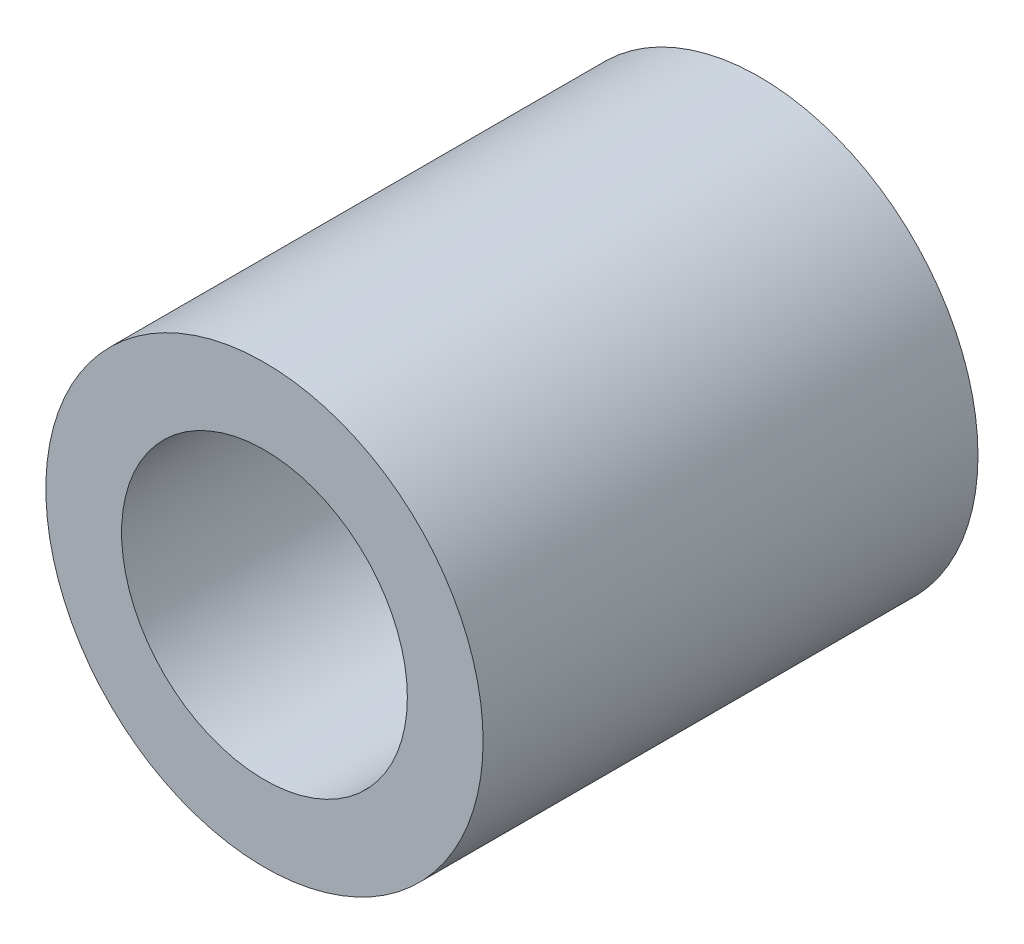
ISO-10303-21;
HEADER;
FILE_DESCRIPTION(('STEP AP214'),'2;1');
FILE_NAME('part.step','',(''),(''),'','','');
FILE_SCHEMA(('AUTOMOTIVE_DESIGN { 1 0 10303 214 1 1 1 1 }'));
ENDSEC;
DATA;
#1=APPLICATION_CONTEXT('core data for automotive mechanical design processes');
#2=APPLICATION_PROTOCOL_DEFINITION('international standard','automotive_design',2000,#1);
#3=PRODUCT_CONTEXT('',#1,'mechanical');
#4=PRODUCT('Part','Part','',(#3));
#5=PRODUCT_RELATED_PRODUCT_CATEGORY('part','',(#4));
#6=PRODUCT_DEFINITION_FORMATION('','',#4);
#7=PRODUCT_DEFINITION_CONTEXT('part definition',#1,'design');
#8=PRODUCT_DEFINITION('design','',#6,#7);
#9=PRODUCT_DEFINITION_SHAPE('','',#8);
#10=(LENGTH_UNIT() NAMED_UNIT(*) SI_UNIT(.MILLI.,.METRE.));
#11=(NAMED_UNIT(*) PLANE_ANGLE_UNIT() SI_UNIT($,.RADIAN.));
#12=(NAMED_UNIT(*) SI_UNIT($,.STERADIAN.) SOLID_ANGLE_UNIT());
#13=UNCERTAINTY_MEASURE_WITH_UNIT(LENGTH_MEASURE(1.E-05),#10,'distance_accuracy_value','');
#14=(GEOMETRIC_REPRESENTATION_CONTEXT(3) GLOBAL_UNCERTAINTY_ASSIGNED_CONTEXT((#13)) GLOBAL_UNIT_ASSIGNED_CONTEXT((#10,
#11,#12)) REPRESENTATION_CONTEXT('',''));
#15=CARTESIAN_POINT('',(0.,0.,0.));
#16=DIRECTION('',(0.,0.,1.));
#17=DIRECTION('',(1.,0.,0.));
#18=AXIS2_PLACEMENT_3D('',#15,#16,#17);
#19=CARTESIAN_POINT('',(0.,0.,-38.1));
#20=DIRECTION('',(0.,0.,1.));
#21=DIRECTION('',(1.,0.,0.));
#22=AXIS2_PLACEMENT_3D('',#19,#20,#21);
#23=CYLINDRICAL_SURFACE('',#22,16.8313886282008);
#24=CARTESIAN_POINT('',(0.,0.,-38.1));
#25=DIRECTION('',(0.,0.,1.));
#26=DIRECTION('',(1.,0.,0.));
#27=AXIS2_PLACEMENT_3D('',#24,#25,#26);
#28=CIRCLE('',#27,16.8313886282008);
#29=CARTESIAN_POINT('',(16.8313886282008,0.,-38.1));
#30=VERTEX_POINT('',#29);
#31=EDGE_CURVE('E10',#30,#30,#28,.T.);
#32=CARTESIAN_POINT('',(0.,0.,0.));
#33=DIRECTION('',(0.,0.,1.));
#34=DIRECTION('',(1.,0.,0.));
#35=AXIS2_PLACEMENT_3D('',#32,#33,#34);
#36=CIRCLE('',#35,16.8313886282008);
#37=CARTESIAN_POINT('',(16.8313886282008,0.,0.));
#38=VERTEX_POINT('',#37);
#39=EDGE_CURVE('E35',#38,#38,#36,.T.);
#40=CARTESIAN_POINT('',(16.8313886282008,0.,-38.1));
#41=CARTESIAN_POINT('',(16.8313886282008,0.,-37.703125));
#42=CARTESIAN_POINT('',(16.8313886282008,0.,-37.30625));
#43=CARTESIAN_POINT('',(16.8313886282008,0.,-36.5125));
#44=CARTESIAN_POINT('',(16.8313886282008,0.,-36.115625));
#45=CARTESIAN_POINT('',(16.8313886282008,0.,-35.321875));
#46=CARTESIAN_POINT('',(16.8313886282008,0.,-34.925));
#47=CARTESIAN_POINT('',(16.8313886282008,0.,-34.13125));
#48=CARTESIAN_POINT('',(16.8313886282008,0.,-33.734375));
#49=CARTESIAN_POINT('',(16.8313886282008,0.,-32.940625));
#50=CARTESIAN_POINT('',(16.8313886282008,0.,-32.54375));
#51=CARTESIAN_POINT('',(16.8313886282008,0.,-31.75));
#52=CARTESIAN_POINT('',(16.8313886282008,0.,-31.353125));
#53=CARTESIAN_POINT('',(16.8313886282008,0.,-30.559375));
#54=CARTESIAN_POINT('',(16.8313886282008,0.,-30.1625));
#55=CARTESIAN_POINT('',(16.8313886282008,0.,-29.36875));
#56=CARTESIAN_POINT('',(16.8313886282008,0.,-28.971875));
#57=CARTESIAN_POINT('',(16.8313886282008,0.,-28.178125));
#58=CARTESIAN_POINT('',(16.8313886282008,0.,-27.78125));
#59=CARTESIAN_POINT('',(16.8313886282008,0.,-26.9875));
#60=CARTESIAN_POINT('',(16.8313886282008,0.,-26.590625));
#61=CARTESIAN_POINT('',(16.8313886282008,0.,-25.796875));
#62=CARTESIAN_POINT('',(16.8313886282008,0.,-25.4));
#63=CARTESIAN_POINT('',(16.8313886282008,0.,-24.60625));
#64=CARTESIAN_POINT('',(16.8313886282008,0.,-24.209375));
#65=CARTESIAN_POINT('',(16.8313886282008,0.,-23.415625));
#66=CARTESIAN_POINT('',(16.8313886282008,0.,-23.01875));
#67=CARTESIAN_POINT('',(16.8313886282008,0.,-22.225));
#68=CARTESIAN_POINT('',(16.8313886282008,0.,-21.828125));
#69=CARTESIAN_POINT('',(16.8313886282008,0.,-21.034375));
#70=CARTESIAN_POINT('',(16.8313886282008,0.,-20.6375));
#71=CARTESIAN_POINT('',(16.8313886282008,0.,-19.84375));
#72=CARTESIAN_POINT('',(16.8313886282008,0.,-19.446875));
#73=CARTESIAN_POINT('',(16.8313886282008,0.,-18.653125));
#74=CARTESIAN_POINT('',(16.8313886282008,0.,-18.25625));
#75=CARTESIAN_POINT('',(16.8313886282008,0.,-17.4625));
#76=CARTESIAN_POINT('',(16.8313886282008,0.,-17.065625));
#77=CARTESIAN_POINT('',(16.8313886282008,0.,-16.271875));
#78=CARTESIAN_POINT('',(16.8313886282008,0.,-15.875));
#79=CARTESIAN_POINT('',(16.8313886282008,0.,-15.08125));
#80=CARTESIAN_POINT('',(16.8313886282008,0.,-14.684375));
#81=CARTESIAN_POINT('',(16.8313886282008,0.,-13.890625));
#82=CARTESIAN_POINT('',(16.8313886282008,0.,-13.49375));
#83=CARTESIAN_POINT('',(16.8313886282008,0.,-12.7));
#84=CARTESIAN_POINT('',(16.8313886282008,0.,-12.303125));
#85=CARTESIAN_POINT('',(16.8313886282008,0.,-11.509375));
#86=CARTESIAN_POINT('',(16.8313886282008,0.,-11.1125));
#87=CARTESIAN_POINT('',(16.8313886282008,0.,-10.31875));
#88=CARTESIAN_POINT('',(16.8313886282008,0.,-9.921875));
#89=CARTESIAN_POINT('',(16.8313886282008,0.,-9.128125));
#90=CARTESIAN_POINT('',(16.8313886282008,0.,-8.73125));
#91=CARTESIAN_POINT('',(16.8313886282008,0.,-7.9375));
#92=CARTESIAN_POINT('',(16.8313886282008,0.,-7.540625));
#93=CARTESIAN_POINT('',(16.8313886282008,0.,-6.746875));
#94=CARTESIAN_POINT('',(16.8313886282008,0.,-6.35));
#95=CARTESIAN_POINT('',(16.8313886282008,0.,-5.55625));
#96=CARTESIAN_POINT('',(16.8313886282008,0.,-5.159375));
#97=CARTESIAN_POINT('',(16.8313886282008,0.,-4.365625));
#98=CARTESIAN_POINT('',(16.8313886282008,0.,-3.96875));
#99=CARTESIAN_POINT('',(16.8313886282008,0.,-3.175));
#100=CARTESIAN_POINT('',(16.8313886282008,0.,-2.778125));
#101=CARTESIAN_POINT('',(16.8313886282008,0.,-1.984375));
#102=CARTESIAN_POINT('',(16.8313886282008,0.,-1.5875));
#103=CARTESIAN_POINT('',(16.8313886282008,0.,-0.79375));
#104=CARTESIAN_POINT('',(16.8313886282008,0.,-0.396875));
#105=CARTESIAN_POINT('',(16.8313886282008,0.,0.));
#106=B_SPLINE_CURVE_WITH_KNOTS('',3,(#40,#41,#42,#43,#44,#45,#46,#47,#48,#49,#50,#51,#52,#53,
#54,#55,#56,#57,#58,#59,#60,#61,#62,#63,#64,#65,#66,#67,#68,#69,#70,#71,#72,#73,#74,#75,#76,#77,
#78,#79,#80,#81,#82,#83,#84,#85,#86,#87,#88,#89,#90,#91,#92,#93,#94,#95,#96,#97,#98,#99,#100,
#101,#102,#103,#104,#105),.UNSPECIFIED.,.F.,.F.,(4,2,2,2,2,2,2,2,2,2,2,2,2,2,2,2,2,2,2,2,2,2,2,
2,2,2,2,2,2,2,2,2,4),(0.,1.19062499999999,2.38124999999999,3.571875,4.7625,5.953125,7.14375,
8.334375,9.525,10.715625,11.90625,13.096875,14.2875,15.478125,16.66875,17.859375,19.05,
20.240625,21.43125,22.621875,23.8125,25.003125,26.19375,27.384375,28.575,29.765625,30.95625,
32.146875,33.3375,34.528125,35.71875,36.909375,38.1),.UNSPECIFIED.);
#107=EDGE_CURVE('BSEAM32',#30,#38,#106,.T.);
#108=ORIENTED_EDGE('',*,*,#31,.T.);
#109=ORIENTED_EDGE('',*,*,#39,.F.);
#110=ORIENTED_EDGE('',*,*,#107,.T.);
#111=ORIENTED_EDGE('',*,*,#107,.F.);
#112=EDGE_LOOP('',(#108,#110,#109,#111));
#113=FACE_BOUND('',#112,.T.);
#114=ADVANCED_FACE('F32',(#113),#23,.T.);
#115=CARTESIAN_POINT('',(0.,0.,-38.1));
#116=DIRECTION('',(0.,0.,1.));
#117=DIRECTION('',(1.,0.,0.));
#118=AXIS2_PLACEMENT_3D('',#115,#116,#117);
#119=PLANE('',#118);
#120=CARTESIAN_POINT('',(0.,0.,-38.1));
#121=DIRECTION('',(0.,0.,1.));
#122=DIRECTION('',(1.,0.,0.));
#123=AXIS2_PLACEMENT_3D('',#120,#121,#122);
#124=CIRCLE('',#123,11.);
#125=CARTESIAN_POINT('',(11.,0.,-38.1));
#126=VERTEX_POINT('',#125);
#127=EDGE_CURVE('E42',#126,#126,#124,.T.);
#128=ORIENTED_EDGE('',*,*,#127,.T.);
#129=EDGE_LOOP('',(#128));
#130=FACE_BOUND('',#129,.T.);
#131=ORIENTED_EDGE('',*,*,#31,.F.);
#132=EDGE_LOOP('',(#131));
#133=FACE_BOUND('',#132,.T.);
#134=ADVANCED_FACE('F50',(#130,#133),#119,.F.);
#135=CARTESIAN_POINT('',(0.,0.,0.));
#136=DIRECTION('',(0.,0.,1.));
#137=DIRECTION('',(1.,0.,0.));
#138=AXIS2_PLACEMENT_3D('',#135,#136,#137);
#139=PLANE('',#138);
#140=CARTESIAN_POINT('',(0.,0.,0.));
#141=DIRECTION('',(0.,0.,1.));
#142=DIRECTION('',(1.,0.,0.));
#143=AXIS2_PLACEMENT_3D('',#140,#141,#142);
#144=CIRCLE('',#143,11.);
#145=CARTESIAN_POINT('',(11.,0.,0.));
#146=VERTEX_POINT('',#145);
#147=EDGE_CURVE('E44',#146,#146,#144,.T.);
#148=ORIENTED_EDGE('',*,*,#147,.F.);
#149=EDGE_LOOP('',(#148));
#150=FACE_BOUND('',#149,.T.);
#151=ORIENTED_EDGE('',*,*,#39,.T.);
#152=EDGE_LOOP('',(#151));
#153=FACE_BOUND('',#152,.T.);
#154=ADVANCED_FACE('F56',(#150,#153),#139,.T.);
#155=CARTESIAN_POINT('',(0.,0.,-38.1));
#156=DIRECTION('',(0.,0.,1.));
#157=DIRECTION('',(1.,0.,0.));
#158=AXIS2_PLACEMENT_3D('',#155,#156,#157);
#159=CYLINDRICAL_SURFACE('',#158,11.);
#160=CARTESIAN_POINT('',(11.,0.,-38.1));
#161=CARTESIAN_POINT('',(11.,0.,-37.703125));
#162=CARTESIAN_POINT('',(11.,0.,-37.30625));
#163=CARTESIAN_POINT('',(11.,0.,-36.5125));
#164=CARTESIAN_POINT('',(11.,0.,-36.115625));
#165=CARTESIAN_POINT('',(11.,0.,-35.321875));
#166=CARTESIAN_POINT('',(11.,0.,-34.925));
#167=CARTESIAN_POINT('',(11.,0.,-34.13125));
#168=CARTESIAN_POINT('',(11.,0.,-33.734375));
#169=CARTESIAN_POINT('',(11.,0.,-32.940625));
#170=CARTESIAN_POINT('',(11.,0.,-32.54375));
#171=CARTESIAN_POINT('',(11.,0.,-31.75));
#172=CARTESIAN_POINT('',(11.,0.,-31.353125));
#173=CARTESIAN_POINT('',(11.,0.,-30.559375));
#174=CARTESIAN_POINT('',(11.,0.,-30.1625));
#175=CARTESIAN_POINT('',(11.,0.,-29.36875));
#176=CARTESIAN_POINT('',(11.,0.,-28.971875));
#177=CARTESIAN_POINT('',(11.,0.,-28.178125));
#178=CARTESIAN_POINT('',(11.,0.,-27.78125));
#179=CARTESIAN_POINT('',(11.,0.,-26.9875));
#180=CARTESIAN_POINT('',(11.,0.,-26.590625));
#181=CARTESIAN_POINT('',(11.,0.,-25.796875));
#182=CARTESIAN_POINT('',(11.,0.,-25.4));
#183=CARTESIAN_POINT('',(11.,0.,-24.60625));
#184=CARTESIAN_POINT('',(11.,0.,-24.209375));
#185=CARTESIAN_POINT('',(11.,0.,-23.415625));
#186=CARTESIAN_POINT('',(11.,0.,-23.01875));
#187=CARTESIAN_POINT('',(11.,0.,-22.225));
#188=CARTESIAN_POINT('',(11.,0.,-21.828125));
#189=CARTESIAN_POINT('',(11.,0.,-21.034375));
#190=CARTESIAN_POINT('',(11.,0.,-20.6375));
#191=CARTESIAN_POINT('',(11.,0.,-19.84375));
#192=CARTESIAN_POINT('',(11.,0.,-19.446875));
#193=CARTESIAN_POINT('',(11.,0.,-18.653125));
#194=CARTESIAN_POINT('',(11.,0.,-18.25625));
#195=CARTESIAN_POINT('',(11.,0.,-17.4625));
#196=CARTESIAN_POINT('',(11.,0.,-17.065625));
#197=CARTESIAN_POINT('',(11.,0.,-16.271875));
#198=CARTESIAN_POINT('',(11.,0.,-15.875));
#199=CARTESIAN_POINT('',(11.,0.,-15.08125));
#200=CARTESIAN_POINT('',(11.,0.,-14.684375));
#201=CARTESIAN_POINT('',(11.,0.,-13.890625));
#202=CARTESIAN_POINT('',(11.,0.,-13.49375));
#203=CARTESIAN_POINT('',(11.,0.,-12.7));
#204=CARTESIAN_POINT('',(11.,0.,-12.303125));
#205=CARTESIAN_POINT('',(11.,0.,-11.509375));
#206=CARTESIAN_POINT('',(11.,0.,-11.1125));
#207=CARTESIAN_POINT('',(11.,0.,-10.31875));
#208=CARTESIAN_POINT('',(11.,0.,-9.921875));
#209=CARTESIAN_POINT('',(11.,0.,-9.128125));
#210=CARTESIAN_POINT('',(11.,0.,-8.73125));
#211=CARTESIAN_POINT('',(11.,0.,-7.9375));
#212=CARTESIAN_POINT('',(11.,0.,-7.540625));
#213=CARTESIAN_POINT('',(11.,0.,-6.746875));
#214=CARTESIAN_POINT('',(11.,0.,-6.35));
#215=CARTESIAN_POINT('',(11.,0.,-5.55625));
#216=CARTESIAN_POINT('',(11.,0.,-5.159375));
#217=CARTESIAN_POINT('',(11.,0.,-4.365625));
#218=CARTESIAN_POINT('',(11.,0.,-3.96875));
#219=CARTESIAN_POINT('',(11.,0.,-3.175));
#220=CARTESIAN_POINT('',(11.,0.,-2.778125));
#221=CARTESIAN_POINT('',(11.,0.,-1.984375));
#222=CARTESIAN_POINT('',(11.,0.,-1.5875));
#223=CARTESIAN_POINT('',(11.,0.,-0.79375));
#224=CARTESIAN_POINT('',(11.,0.,-0.396875));
#225=CARTESIAN_POINT('',(11.,0.,0.));
#226=B_SPLINE_CURVE_WITH_KNOTS('',3,(#160,#161,#162,#163,#164,#165,#166,#167,#168,#169,#170,
#171,#172,#173,#174,#175,#176,#177,#178,#179,#180,#181,#182,#183,#184,#185,#186,#187,#188,#189,
#190,#191,#192,#193,#194,#195,#196,#197,#198,#199,#200,#201,#202,#203,#204,#205,#206,#207,#208,
#209,#210,#211,#212,#213,#214,#215,#216,#217,#218,#219,#220,#221,#222,#223,#224,#225),
.UNSPECIFIED.,.F.,.F.,(4,2,2,2,2,2,2,2,2,2,2,2,2,2,2,2,2,2,2,2,2,2,2,2,2,2,2,2,2,2,2,2,4),(0.,
1.190625,2.38125,3.571875,4.7625,5.953125,7.14375,8.334375,9.52500000000001,10.715625,11.90625,
13.096875,14.2875,15.478125,16.66875,17.859375,19.05,20.240625,21.43125,22.621875,23.8125,
25.003125,26.19375,27.384375,28.575,29.765625,30.95625,32.146875,33.3375,34.528125,35.71875,
36.909375,38.1),.UNSPECIFIED.);
#227=EDGE_CURVE('BSEAM53',#126,#146,#226,.T.);
#228=ORIENTED_EDGE('',*,*,#127,.F.);
#229=ORIENTED_EDGE('',*,*,#147,.T.);
#230=ORIENTED_EDGE('',*,*,#227,.T.);
#231=ORIENTED_EDGE('',*,*,#227,.F.);
#232=EDGE_LOOP('',(#228,#230,#229,#231));
#233=FACE_BOUND('',#232,.T.);
#234=ADVANCED_FACE('F53',(#233),#159,.F.);
#235=CLOSED_SHELL('',(#114,#134,#154,#234));
#236=MANIFOLD_SOLID_BREP('B2',#235);
#237=ADVANCED_BREP_SHAPE_REPRESENTATION('',(#18,#236),#14);
#238=SHAPE_DEFINITION_REPRESENTATION(#9,#237);
ENDSEC;
END-ISO-10303-21;
